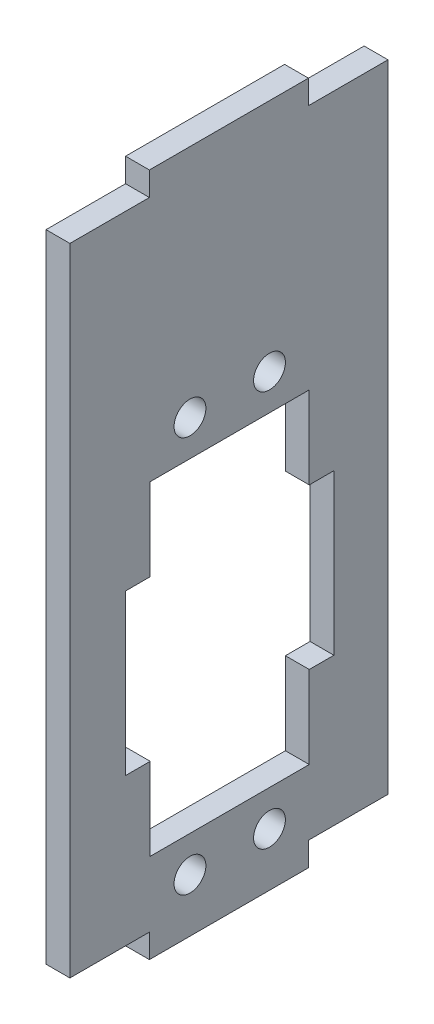
ISO-10303-21;
HEADER;
FILE_DESCRIPTION(('STEP AP214'),'2;1');
FILE_NAME('part.step','',(''),(''),'','','');
FILE_SCHEMA(('AUTOMOTIVE_DESIGN { 1 0 10303 214 1 1 1 1 }'));
ENDSEC;
DATA;
#1=APPLICATION_CONTEXT('core data for automotive mechanical design processes');
#2=APPLICATION_PROTOCOL_DEFINITION('international standard','automotive_design',2000,#1);
#3=PRODUCT_CONTEXT('',#1,'mechanical');
#4=PRODUCT('Part','Part','',(#3));
#5=PRODUCT_RELATED_PRODUCT_CATEGORY('part','',(#4));
#6=PRODUCT_DEFINITION_FORMATION('','',#4);
#7=PRODUCT_DEFINITION_CONTEXT('part definition',#1,'design');
#8=PRODUCT_DEFINITION('design','',#6,#7);
#9=PRODUCT_DEFINITION_SHAPE('','',#8);
#10=(LENGTH_UNIT() NAMED_UNIT(*) SI_UNIT(.MILLI.,.METRE.));
#11=(NAMED_UNIT(*) PLANE_ANGLE_UNIT() SI_UNIT($,.RADIAN.));
#12=(NAMED_UNIT(*) SI_UNIT($,.STERADIAN.) SOLID_ANGLE_UNIT());
#13=UNCERTAINTY_MEASURE_WITH_UNIT(LENGTH_MEASURE(1.E-05),#10,'distance_accuracy_value','');
#14=(GEOMETRIC_REPRESENTATION_CONTEXT(3) GLOBAL_UNCERTAINTY_ASSIGNED_CONTEXT((#13)) GLOBAL_UNIT_ASSIGNED_CONTEXT((#10,
#11,#12)) REPRESENTATION_CONTEXT('',''));
#15=CARTESIAN_POINT('',(0.,0.,0.));
#16=DIRECTION('',(0.,0.,1.));
#17=DIRECTION('',(1.,0.,0.));
#18=AXIS2_PLACEMENT_3D('',#15,#16,#17);
#19=CARTESIAN_POINT('',(0.,89.2755790734939,11.5037745496095));
#20=DIRECTION('',(0.,1.,0.));
#21=DIRECTION('',(0.,0.,1.));
#22=AXIS2_PLACEMENT_3D('',#19,#20,#21);
#23=PLANE('',#22);
#24=DIRECTION('',(0.,0.,1.));
#25=VECTOR('',#24,1.);
#26=CARTESIAN_POINT('',(3.,89.2755790734939,11.5037745496095));
#27=LINE('',#26,#25);
#28=CARTESIAN_POINT('',(3.,89.2755790734939,11.5037745496095));
#29=VERTEX_POINT('',#28);
#30=CARTESIAN_POINT('',(3.,89.2755790734939,31.5037745496095));
#31=VERTEX_POINT('',#30);
#32=EDGE_CURVE('E308',#29,#31,#27,.T.);
#33=ORIENTED_EDGE('',*,*,#32,.F.);
#34=DIRECTION('',(1.,0.,0.));
#35=VECTOR('',#34,1.);
#36=CARTESIAN_POINT('',(0.,89.2755790734939,11.5037745496095));
#37=LINE('',#36,#35);
#38=CARTESIAN_POINT('',(0.,89.2755790734939,11.5037745496095));
#39=VERTEX_POINT('',#38);
#40=EDGE_CURVE('E11',#39,#29,#37,.T.);
#41=ORIENTED_EDGE('',*,*,#40,.F.);
#42=DIRECTION('',(0.,0.,1.));
#43=VECTOR('',#42,1.);
#44=CARTESIAN_POINT('',(0.,89.2755790734939,11.5037745496095));
#45=LINE('',#44,#43);
#46=CARTESIAN_POINT('',(0.,89.2755790734939,31.5037745496095));
#47=VERTEX_POINT('',#46);
#48=EDGE_CURVE('E311',#39,#47,#45,.T.);
#49=ORIENTED_EDGE('',*,*,#48,.T.);
#50=DIRECTION('',(1.,0.,0.));
#51=VECTOR('',#50,1.);
#52=CARTESIAN_POINT('',(0.,89.2755790734939,31.5037745496095));
#53=LINE('',#52,#51);
#54=EDGE_CURVE('E36',#47,#31,#53,.T.);
#55=ORIENTED_EDGE('',*,*,#54,.T.);
#56=EDGE_LOOP('',(#33,#41,#49,#55));
#57=FACE_BOUND('',#56,.T.);
#58=ADVANCED_FACE('F33',(#57),#23,.T.);
#59=CARTESIAN_POINT('',(0.,86.275579073494,11.5037745496095));
#60=DIRECTION('',(0.,0.,-1.));
#61=DIRECTION('',(-1.,0.,0.));
#62=AXIS2_PLACEMENT_3D('',#59,#60,#61);
#63=PLANE('',#62);
#64=DIRECTION('',(0.,1.,0.));
#65=VECTOR('',#64,1.);
#66=CARTESIAN_POINT('',(3.,86.275579073494,11.5037745496095));
#67=LINE('',#66,#65);
#68=CARTESIAN_POINT('',(3.,86.275579073494,11.5037745496095));
#69=VERTEX_POINT('',#68);
#70=EDGE_CURVE('E315',#69,#29,#67,.T.);
#71=ORIENTED_EDGE('',*,*,#70,.F.);
#72=DIRECTION('',(1.,0.,0.));
#73=VECTOR('',#72,1.);
#74=CARTESIAN_POINT('',(0.,86.275579073494,11.5037745496095));
#75=LINE('',#74,#73);
#76=CARTESIAN_POINT('',(0.,86.275579073494,11.5037745496095));
#77=VERTEX_POINT('',#76);
#78=EDGE_CURVE('E41',#77,#69,#75,.T.);
#79=ORIENTED_EDGE('',*,*,#78,.F.);
#80=DIRECTION('',(0.,1.,0.));
#81=VECTOR('',#80,1.);
#82=CARTESIAN_POINT('',(0.,86.275579073494,11.5037745496095));
#83=LINE('',#82,#81);
#84=EDGE_CURVE('E345',#77,#39,#83,.T.);
#85=ORIENTED_EDGE('',*,*,#84,.T.);
#86=ORIENTED_EDGE('',*,*,#40,.T.);
#87=EDGE_LOOP('',(#71,#79,#85,#86));
#88=FACE_BOUND('',#87,.T.);
#89=ADVANCED_FACE('F411',(#88),#63,.T.);
#90=CARTESIAN_POINT('',(0.,86.2755790734939,1.50377454960949));
#91=DIRECTION('',(0.,1.,0.));
#92=DIRECTION('',(0.,0.,1.));
#93=AXIS2_PLACEMENT_3D('',#90,#91,#92);
#94=PLANE('',#93);
#95=DIRECTION('',(0.,0.,1.));
#96=VECTOR('',#95,1.);
#97=CARTESIAN_POINT('',(3.,86.2755790734939,1.50377454960949));
#98=LINE('',#97,#96);
#99=CARTESIAN_POINT('',(3.,86.2755790734939,1.50377454960949));
#100=VERTEX_POINT('',#99);
#101=EDGE_CURVE('E377',#100,#69,#98,.T.);
#102=ORIENTED_EDGE('',*,*,#101,.F.);
#103=DIRECTION('',(1.,0.,0.));
#104=VECTOR('',#103,1.);
#105=CARTESIAN_POINT('',(0.,86.2755790734939,1.50377454960949));
#106=LINE('',#105,#104);
#107=CARTESIAN_POINT('',(0.,86.2755790734939,1.50377454960949));
#108=VERTEX_POINT('',#107);
#109=EDGE_CURVE('E383',#108,#100,#106,.T.);
#110=ORIENTED_EDGE('',*,*,#109,.F.);
#111=DIRECTION('',(0.,0.,1.));
#112=VECTOR('',#111,1.);
#113=CARTESIAN_POINT('',(0.,86.2755790734939,1.50377454960949));
#114=LINE('',#113,#112);
#115=EDGE_CURVE('E342',#108,#77,#114,.T.);
#116=ORIENTED_EDGE('',*,*,#115,.T.);
#117=ORIENTED_EDGE('',*,*,#78,.T.);
#118=EDGE_LOOP('',(#102,#110,#116,#117));
#119=FACE_BOUND('',#118,.T.);
#120=ADVANCED_FACE('F448',(#119),#94,.T.);
#121=CARTESIAN_POINT('',(0.,6.27557907349394,1.50377454960949));
#122=DIRECTION('',(0.,0.,-1.));
#123=DIRECTION('',(-1.,0.,0.));
#124=AXIS2_PLACEMENT_3D('',#121,#122,#123);
#125=PLANE('',#124);
#126=DIRECTION('',(0.,1.,0.));
#127=VECTOR('',#126,1.);
#128=CARTESIAN_POINT('',(3.,6.27557907349394,1.50377454960949));
#129=LINE('',#128,#127);
#130=CARTESIAN_POINT('',(3.,6.27557907349394,1.50377454960949));
#131=VERTEX_POINT('',#130);
#132=EDGE_CURVE('E374',#131,#100,#129,.T.);
#133=ORIENTED_EDGE('',*,*,#132,.F.);
#134=DIRECTION('',(1.,0.,0.));
#135=VECTOR('',#134,1.);
#136=CARTESIAN_POINT('',(0.,6.27557907349394,1.50377454960949));
#137=LINE('',#136,#135);
#138=CARTESIAN_POINT('',(0.,6.27557907349394,1.50377454960949));
#139=VERTEX_POINT('',#138);
#140=EDGE_CURVE('E385',#139,#131,#137,.T.);
#141=ORIENTED_EDGE('',*,*,#140,.F.);
#142=DIRECTION('',(0.,1.,0.));
#143=VECTOR('',#142,1.);
#144=CARTESIAN_POINT('',(0.,6.27557907349394,1.50377454960949));
#145=LINE('',#144,#143);
#146=EDGE_CURVE('E339',#139,#108,#145,.T.);
#147=ORIENTED_EDGE('',*,*,#146,.T.);
#148=ORIENTED_EDGE('',*,*,#109,.T.);
#149=EDGE_LOOP('',(#133,#141,#147,#148));
#150=FACE_BOUND('',#149,.T.);
#151=ADVANCED_FACE('F445',(#150),#125,.T.);
#152=CARTESIAN_POINT('',(0.,6.27557907349394,11.5037745496095));
#153=DIRECTION('',(0.,-1.,0.));
#154=DIRECTION('',(0.,0.,-1.));
#155=AXIS2_PLACEMENT_3D('',#152,#153,#154);
#156=PLANE('',#155);
#157=DIRECTION('',(0.,0.,-1.));
#158=VECTOR('',#157,1.);
#159=CARTESIAN_POINT('',(3.,6.27557907349394,11.5037745496095));
#160=LINE('',#159,#158);
#161=CARTESIAN_POINT('',(3.,6.27557907349394,11.5037745496095));
#162=VERTEX_POINT('',#161);
#163=EDGE_CURVE('E371',#162,#131,#160,.T.);
#164=ORIENTED_EDGE('',*,*,#163,.F.);
#165=DIRECTION('',(1.,0.,0.));
#166=VECTOR('',#165,1.);
#167=CARTESIAN_POINT('',(0.,6.27557907349394,11.5037745496095));
#168=LINE('',#167,#166);
#169=CARTESIAN_POINT('',(0.,6.27557907349394,11.5037745496095));
#170=VERTEX_POINT('',#169);
#171=EDGE_CURVE('E387',#170,#162,#168,.T.);
#172=ORIENTED_EDGE('',*,*,#171,.F.);
#173=DIRECTION('',(0.,0.,-1.));
#174=VECTOR('',#173,1.);
#175=CARTESIAN_POINT('',(0.,6.27557907349394,11.5037745496095));
#176=LINE('',#175,#174);
#177=EDGE_CURVE('E336',#170,#139,#176,.T.);
#178=ORIENTED_EDGE('',*,*,#177,.T.);
#179=ORIENTED_EDGE('',*,*,#140,.T.);
#180=EDGE_LOOP('',(#164,#172,#178,#179));
#181=FACE_BOUND('',#180,.T.);
#182=ADVANCED_FACE('F442',(#181),#156,.T.);
#183=CARTESIAN_POINT('',(0.,3.27557907349393,11.5037745496095));
#184=DIRECTION('',(0.,0.,-1.));
#185=DIRECTION('',(-1.,0.,0.));
#186=AXIS2_PLACEMENT_3D('',#183,#184,#185);
#187=PLANE('',#186);
#188=DIRECTION('',(0.,1.,0.));
#189=VECTOR('',#188,1.);
#190=CARTESIAN_POINT('',(3.,3.27557907349393,11.5037745496095));
#191=LINE('',#190,#189);
#192=CARTESIAN_POINT('',(3.,3.27557907349393,11.5037745496095));
#193=VERTEX_POINT('',#192);
#194=EDGE_CURVE('E368',#193,#162,#191,.T.);
#195=ORIENTED_EDGE('',*,*,#194,.F.);
#196=DIRECTION('',(1.,0.,0.));
#197=VECTOR('',#196,1.);
#198=CARTESIAN_POINT('',(0.,3.27557907349393,11.5037745496095));
#199=LINE('',#198,#197);
#200=CARTESIAN_POINT('',(0.,3.27557907349393,11.5037745496095));
#201=VERTEX_POINT('',#200);
#202=EDGE_CURVE('E389',#201,#193,#199,.T.);
#203=ORIENTED_EDGE('',*,*,#202,.F.);
#204=DIRECTION('',(0.,1.,0.));
#205=VECTOR('',#204,1.);
#206=CARTESIAN_POINT('',(0.,3.27557907349393,11.5037745496095));
#207=LINE('',#206,#205);
#208=EDGE_CURVE('E333',#201,#170,#207,.T.);
#209=ORIENTED_EDGE('',*,*,#208,.T.);
#210=ORIENTED_EDGE('',*,*,#171,.T.);
#211=EDGE_LOOP('',(#195,#203,#209,#210));
#212=FACE_BOUND('',#211,.T.);
#213=ADVANCED_FACE('F438',(#212),#187,.T.);
#214=CARTESIAN_POINT('',(0.,3.27557907349393,31.5037745496095));
#215=DIRECTION('',(0.,-1.,0.));
#216=DIRECTION('',(0.,0.,-1.));
#217=AXIS2_PLACEMENT_3D('',#214,#215,#216);
#218=PLANE('',#217);
#219=DIRECTION('',(0.,0.,-1.));
#220=VECTOR('',#219,1.);
#221=CARTESIAN_POINT('',(3.,3.27557907349393,31.5037745496095));
#222=LINE('',#221,#220);
#223=CARTESIAN_POINT('',(3.,3.27557907349393,31.5037745496095));
#224=VERTEX_POINT('',#223);
#225=EDGE_CURVE('E365',#224,#193,#222,.T.);
#226=ORIENTED_EDGE('',*,*,#225,.F.);
#227=DIRECTION('',(1.,0.,0.));
#228=VECTOR('',#227,1.);
#229=CARTESIAN_POINT('',(0.,3.27557907349393,31.5037745496095));
#230=LINE('',#229,#228);
#231=CARTESIAN_POINT('',(0.,3.27557907349393,31.5037745496095));
#232=VERTEX_POINT('',#231);
#233=EDGE_CURVE('E391',#232,#224,#230,.T.);
#234=ORIENTED_EDGE('',*,*,#233,.F.);
#235=DIRECTION('',(0.,0.,-1.));
#236=VECTOR('',#235,1.);
#237=CARTESIAN_POINT('',(0.,3.27557907349393,31.5037745496095));
#238=LINE('',#237,#236);
#239=EDGE_CURVE('E330',#232,#201,#238,.T.);
#240=ORIENTED_EDGE('',*,*,#239,.T.);
#241=ORIENTED_EDGE('',*,*,#202,.T.);
#242=EDGE_LOOP('',(#226,#234,#240,#241));
#243=FACE_BOUND('',#242,.T.);
#244=ADVANCED_FACE('F434',(#243),#218,.T.);
#245=CARTESIAN_POINT('',(0.,6.27557907349394,31.5037745496095));
#246=DIRECTION('',(0.,0.,1.));
#247=DIRECTION('',(1.,0.,0.));
#248=AXIS2_PLACEMENT_3D('',#245,#246,#247);
#249=PLANE('',#248);
#250=DIRECTION('',(0.,-1.,0.));
#251=VECTOR('',#250,1.);
#252=CARTESIAN_POINT('',(3.,6.27557907349394,31.5037745496095));
#253=LINE('',#252,#251);
#254=CARTESIAN_POINT('',(3.,6.27557907349394,31.5037745496095));
#255=VERTEX_POINT('',#254);
#256=EDGE_CURVE('E362',#255,#224,#253,.T.);
#257=ORIENTED_EDGE('',*,*,#256,.F.);
#258=DIRECTION('',(1.,0.,0.));
#259=VECTOR('',#258,1.);
#260=CARTESIAN_POINT('',(0.,6.27557907349394,31.5037745496095));
#261=LINE('',#260,#259);
#262=CARTESIAN_POINT('',(0.,6.27557907349394,31.5037745496095));
#263=VERTEX_POINT('',#262);
#264=EDGE_CURVE('E393',#263,#255,#261,.T.);
#265=ORIENTED_EDGE('',*,*,#264,.F.);
#266=DIRECTION('',(0.,-1.,0.));
#267=VECTOR('',#266,1.);
#268=CARTESIAN_POINT('',(0.,6.27557907349394,31.5037745496095));
#269=LINE('',#268,#267);
#270=EDGE_CURVE('E327',#263,#232,#269,.T.);
#271=ORIENTED_EDGE('',*,*,#270,.T.);
#272=ORIENTED_EDGE('',*,*,#233,.T.);
#273=EDGE_LOOP('',(#257,#265,#271,#272));
#274=FACE_BOUND('',#273,.T.);
#275=ADVANCED_FACE('F430',(#274),#249,.T.);
#276=CARTESIAN_POINT('',(0.,6.27557907349394,41.5037745496095));
#277=DIRECTION('',(0.,-1.,0.));
#278=DIRECTION('',(0.,0.,-1.));
#279=AXIS2_PLACEMENT_3D('',#276,#277,#278);
#280=PLANE('',#279);
#281=DIRECTION('',(0.,0.,-1.));
#282=VECTOR('',#281,1.);
#283=CARTESIAN_POINT('',(3.,6.27557907349394,41.5037745496095));
#284=LINE('',#283,#282);
#285=CARTESIAN_POINT('',(3.,6.27557907349394,41.5037745496095));
#286=VERTEX_POINT('',#285);
#287=EDGE_CURVE('E359',#286,#255,#284,.T.);
#288=ORIENTED_EDGE('',*,*,#287,.F.);
#289=DIRECTION('',(1.,0.,0.));
#290=VECTOR('',#289,1.);
#291=CARTESIAN_POINT('',(0.,6.27557907349394,41.5037745496095));
#292=LINE('',#291,#290);
#293=CARTESIAN_POINT('',(0.,6.27557907349394,41.5037745496095));
#294=VERTEX_POINT('',#293);
#295=EDGE_CURVE('E395',#294,#286,#292,.T.);
#296=ORIENTED_EDGE('',*,*,#295,.F.);
#297=DIRECTION('',(0.,0.,-1.));
#298=VECTOR('',#297,1.);
#299=CARTESIAN_POINT('',(0.,6.27557907349394,41.5037745496095));
#300=LINE('',#299,#298);
#301=EDGE_CURVE('E324',#294,#263,#300,.T.);
#302=ORIENTED_EDGE('',*,*,#301,.T.);
#303=ORIENTED_EDGE('',*,*,#264,.T.);
#304=EDGE_LOOP('',(#288,#296,#302,#303));
#305=FACE_BOUND('',#304,.T.);
#306=ADVANCED_FACE('F426',(#305),#280,.T.);
#307=CARTESIAN_POINT('',(0.,86.2755790734939,41.5037745496095));
#308=DIRECTION('',(0.,0.,1.));
#309=DIRECTION('',(0.,-1.,0.));
#310=AXIS2_PLACEMENT_3D('',#307,#308,#309);
#311=PLANE('',#310);
#312=DIRECTION('',(0.,-1.,0.));
#313=VECTOR('',#312,1.);
#314=CARTESIAN_POINT('',(3.,86.2755790734939,41.5037745496095));
#315=LINE('',#314,#313);
#316=CARTESIAN_POINT('',(3.,86.2755790734939,41.5037745496095));
#317=VERTEX_POINT('',#316);
#318=EDGE_CURVE('E356',#317,#286,#315,.T.);
#319=ORIENTED_EDGE('',*,*,#318,.F.);
#320=DIRECTION('',(1.,0.,0.));
#321=VECTOR('',#320,1.);
#322=CARTESIAN_POINT('',(0.,86.2755790734939,41.5037745496095));
#323=LINE('',#322,#321);
#324=CARTESIAN_POINT('',(0.,86.2755790734939,41.5037745496095));
#325=VERTEX_POINT('',#324);
#326=EDGE_CURVE('E397',#325,#317,#323,.T.);
#327=ORIENTED_EDGE('',*,*,#326,.F.);
#328=DIRECTION('',(0.,-1.,0.));
#329=VECTOR('',#328,1.);
#330=CARTESIAN_POINT('',(0.,86.2755790734939,41.5037745496095));
#331=LINE('',#330,#329);
#332=EDGE_CURVE('E321',#325,#294,#331,.T.);
#333=ORIENTED_EDGE('',*,*,#332,.T.);
#334=ORIENTED_EDGE('',*,*,#295,.T.);
#335=EDGE_LOOP('',(#319,#327,#333,#334));
#336=FACE_BOUND('',#335,.T.);
#337=ADVANCED_FACE('F424',(#336),#311,.T.);
#338=CARTESIAN_POINT('',(0.,86.275579073494,31.5037745496095));
#339=DIRECTION('',(0.,1.,0.));
#340=DIRECTION('',(0.,0.,1.));
#341=AXIS2_PLACEMENT_3D('',#338,#339,#340);
#342=PLANE('',#341);
#343=DIRECTION('',(0.,0.,1.));
#344=VECTOR('',#343,1.);
#345=CARTESIAN_POINT('',(3.,86.275579073494,31.5037745496095));
#346=LINE('',#345,#344);
#347=CARTESIAN_POINT('',(3.,86.275579073494,31.5037745496095));
#348=VERTEX_POINT('',#347);
#349=EDGE_CURVE('E353',#348,#317,#346,.T.);
#350=ORIENTED_EDGE('',*,*,#349,.F.);
#351=DIRECTION('',(1.,0.,0.));
#352=VECTOR('',#351,1.);
#353=CARTESIAN_POINT('',(0.,86.275579073494,31.5037745496095));
#354=LINE('',#353,#352);
#355=CARTESIAN_POINT('',(0.,86.275579073494,31.5037745496095));
#356=VERTEX_POINT('',#355);
#357=EDGE_CURVE('E398',#356,#348,#354,.T.);
#358=ORIENTED_EDGE('',*,*,#357,.F.);
#359=DIRECTION('',(0.,0.,1.));
#360=VECTOR('',#359,1.);
#361=CARTESIAN_POINT('',(0.,86.275579073494,31.5037745496095));
#362=LINE('',#361,#360);
#363=EDGE_CURVE('E318',#356,#325,#362,.T.);
#364=ORIENTED_EDGE('',*,*,#363,.T.);
#365=ORIENTED_EDGE('',*,*,#326,.T.);
#366=EDGE_LOOP('',(#350,#358,#364,#365));
#367=FACE_BOUND('',#366,.T.);
#368=ADVANCED_FACE('F420',(#367),#342,.T.);
#369=CARTESIAN_POINT('',(0.,89.2755790734939,31.5037745496095));
#370=DIRECTION('',(0.,0.,1.));
#371=DIRECTION('',(1.,0.,0.));
#372=AXIS2_PLACEMENT_3D('',#369,#370,#371);
#373=PLANE('',#372);
#374=DIRECTION('',(0.,-1.,0.));
#375=VECTOR('',#374,1.);
#376=CARTESIAN_POINT('',(3.,89.2755790734939,31.5037745496095));
#377=LINE('',#376,#375);
#378=EDGE_CURVE('E350',#31,#348,#377,.T.);
#379=ORIENTED_EDGE('',*,*,#378,.F.);
#380=ORIENTED_EDGE('',*,*,#54,.F.);
#381=DIRECTION('',(0.,-1.,0.));
#382=VECTOR('',#381,1.);
#383=CARTESIAN_POINT('',(0.,89.2755790734939,31.5037745496095));
#384=LINE('',#383,#382);
#385=EDGE_CURVE('E314',#47,#356,#384,.T.);
#386=ORIENTED_EDGE('',*,*,#385,.T.);
#387=ORIENTED_EDGE('',*,*,#357,.T.);
#388=EDGE_LOOP('',(#379,#380,#386,#387));
#389=FACE_BOUND('',#388,.T.);
#390=ADVANCED_FACE('F406',(#389),#373,.T.);
#391=CARTESIAN_POINT('',(0.,0.,0.));
#392=DIRECTION('',(1.,0.,0.));
#393=DIRECTION('',(0.,0.,-1.));
#394=AXIS2_PLACEMENT_3D('',#391,#392,#393);
#395=PLANE('',#394);
#396=CARTESIAN_POINT('',(0.,9.97557907349397,16.4037745496095));
#397=DIRECTION('',(-1.,0.,0.));
#398=DIRECTION('',(0.,0.,-1.));
#399=AXIS2_PLACEMENT_3D('',#396,#397,#398);
#400=CIRCLE('',#399,2.00000000000001);
#401=CARTESIAN_POINT('',(0.,9.97557907349397,14.4037745496095));
#402=VERTEX_POINT('',#401);
#403=EDGE_CURVE('E720',#402,#402,#400,.T.);
#404=ORIENTED_EDGE('',*,*,#403,.F.);
#405=EDGE_LOOP('',(#404));
#406=FACE_BOUND('',#405,.T.);
#407=CARTESIAN_POINT('',(0.,59.775579073494,26.4037745496095));
#408=DIRECTION('',(-1.,0.,0.));
#409=DIRECTION('',(0.,0.,-1.));
#410=AXIS2_PLACEMENT_3D('',#407,#408,#409);
#411=CIRCLE('',#410,2.00000000000001);
#412=CARTESIAN_POINT('',(0.,59.775579073494,24.4037745496095));
#413=VERTEX_POINT('',#412);
#414=EDGE_CURVE('E219',#413,#413,#411,.T.);
#415=ORIENTED_EDGE('',*,*,#414,.F.);
#416=EDGE_LOOP('',(#415));
#417=FACE_BOUND('',#416,.T.);
#418=DIRECTION('',(0.,-1.,0.));
#419=VECTOR('',#418,1.);
#420=CARTESIAN_POINT('',(0.,24.8255790734939,8.30377454960953));
#421=LINE('',#420,#419);
#422=CARTESIAN_POINT('',(0.,44.9255790734939,8.30377454960953));
#423=VERTEX_POINT('',#422);
#424=CARTESIAN_POINT('',(0.,24.8255790734939,8.30377454960953));
#425=VERTEX_POINT('',#424);
#426=EDGE_CURVE('E248',#423,#425,#421,.T.);
#427=ORIENTED_EDGE('',*,*,#426,.F.);
#428=DIRECTION('',(0.,0.,-1.));
#429=VECTOR('',#428,1.);
#430=CARTESIAN_POINT('',(0.,44.9255790734939,8.30377454960953));
#431=LINE('',#430,#429);
#432=CARTESIAN_POINT('',(0.,44.9255790734939,11.4037745496095));
#433=VERTEX_POINT('',#432);
#434=EDGE_CURVE('E49',#433,#423,#431,.T.);
#435=ORIENTED_EDGE('',*,*,#434,.F.);
#436=DIRECTION('',(0.,-1.,0.));
#437=VECTOR('',#436,1.);
#438=CARTESIAN_POINT('',(0.,44.9255790734939,11.4037745496095));
#439=LINE('',#438,#437);
#440=CARTESIAN_POINT('',(0.,55.2755790734939,11.4037745496095));
#441=VERTEX_POINT('',#440);
#442=EDGE_CURVE('E213',#441,#433,#439,.T.);
#443=ORIENTED_EDGE('',*,*,#442,.F.);
#444=DIRECTION('',(0.,0.,-1.));
#445=VECTOR('',#444,1.);
#446=CARTESIAN_POINT('',(0.,55.2755790734939,11.4037745496095));
#447=LINE('',#446,#445);
#448=CARTESIAN_POINT('',(0.,55.2755790734939,31.4037745496095));
#449=VERTEX_POINT('',#448);
#450=EDGE_CURVE('E216',#449,#441,#447,.T.);
#451=ORIENTED_EDGE('',*,*,#450,.F.);
#452=DIRECTION('',(0.,1.,0.));
#453=VECTOR('',#452,1.);
#454=CARTESIAN_POINT('',(0.,55.2755790734939,31.4037745496095));
#455=LINE('',#454,#453);
#456=CARTESIAN_POINT('',(0.,44.9255790734939,31.4037745496095));
#457=VERTEX_POINT('',#456);
#458=EDGE_CURVE('E272',#457,#449,#455,.T.);
#459=ORIENTED_EDGE('',*,*,#458,.F.);
#460=DIRECTION('',(0.,0.,-1.));
#461=VECTOR('',#460,1.);
#462=CARTESIAN_POINT('',(0.,44.9255790734939,31.4037745496095));
#463=LINE('',#462,#461);
#464=CARTESIAN_POINT('',(0.,44.9255790734939,34.5037745496095));
#465=VERTEX_POINT('',#464);
#466=EDGE_CURVE('E269',#465,#457,#463,.T.);
#467=ORIENTED_EDGE('',*,*,#466,.F.);
#468=DIRECTION('',(0.,1.,0.));
#469=VECTOR('',#468,1.);
#470=CARTESIAN_POINT('',(0.,44.9255790734939,34.5037745496095));
#471=LINE('',#470,#469);
#472=CARTESIAN_POINT('',(0.,24.8255790734939,34.5037745496095));
#473=VERTEX_POINT('',#472);
#474=EDGE_CURVE('E266',#473,#465,#471,.T.);
#475=ORIENTED_EDGE('',*,*,#474,.F.);
#476=DIRECTION('',(0.,0.,1.));
#477=VECTOR('',#476,1.);
#478=CARTESIAN_POINT('',(0.,24.8255790734939,34.5037745496095));
#479=LINE('',#478,#477);
#480=CARTESIAN_POINT('',(0.,24.8255790734939,31.4037745496095));
#481=VERTEX_POINT('',#480);
#482=EDGE_CURVE('E263',#481,#473,#479,.T.);
#483=ORIENTED_EDGE('',*,*,#482,.F.);
#484=DIRECTION('',(0.,1.,0.));
#485=VECTOR('',#484,1.);
#486=CARTESIAN_POINT('',(0.,24.8255790734939,31.4037745496095));
#487=LINE('',#486,#485);
#488=CARTESIAN_POINT('',(0.,14.4755790734939,31.4037745496095));
#489=VERTEX_POINT('',#488);
#490=EDGE_CURVE('E260',#489,#481,#487,.T.);
#491=ORIENTED_EDGE('',*,*,#490,.F.);
#492=DIRECTION('',(0.,0.,1.));
#493=VECTOR('',#492,1.);
#494=CARTESIAN_POINT('',(0.,14.4755790734939,31.4037745496095));
#495=LINE('',#494,#493);
#496=CARTESIAN_POINT('',(0.,14.4755790734939,11.4037745496095));
#497=VERTEX_POINT('',#496);
#498=EDGE_CURVE('E257',#497,#489,#495,.T.);
#499=ORIENTED_EDGE('',*,*,#498,.F.);
#500=DIRECTION('',(0.,-1.,0.));
#501=VECTOR('',#500,1.);
#502=CARTESIAN_POINT('',(0.,14.4755790734939,11.4037745496095));
#503=LINE('',#502,#501);
#504=CARTESIAN_POINT('',(0.,24.8255790734939,11.4037745496095));
#505=VERTEX_POINT('',#504);
#506=EDGE_CURVE('E254',#505,#497,#503,.T.);
#507=ORIENTED_EDGE('',*,*,#506,.F.);
#508=DIRECTION('',(0.,0.,1.));
#509=VECTOR('',#508,1.);
#510=CARTESIAN_POINT('',(0.,24.8255790734939,11.4037745496095));
#511=LINE('',#510,#509);
#512=EDGE_CURVE('E251',#425,#505,#511,.T.);
#513=ORIENTED_EDGE('',*,*,#512,.F.);
#514=EDGE_LOOP('',(#427,#435,#443,#451,#459,#467,#475,#483,#491,#499,#507,#513));
#515=FACE_BOUND('',#514,.T.);
#516=CARTESIAN_POINT('',(0.,59.775579073494,16.4037745496095));
#517=DIRECTION('',(-1.,0.,0.));
#518=DIRECTION('',(0.,0.,-1.));
#519=AXIS2_PLACEMENT_3D('',#516,#517,#518);
#520=CIRCLE('',#519,2.00000000000001);
#521=CARTESIAN_POINT('',(0.,59.775579073494,14.4037745496095));
#522=VERTEX_POINT('',#521);
#523=EDGE_CURVE('E279',#522,#522,#520,.T.);
#524=ORIENTED_EDGE('',*,*,#523,.F.);
#525=EDGE_LOOP('',(#524));
#526=FACE_BOUND('',#525,.T.);
#527=CARTESIAN_POINT('',(0.,9.97557907349395,26.4037745496095));
#528=DIRECTION('',(-1.,0.,0.));
#529=DIRECTION('',(0.,0.,-1.));
#530=AXIS2_PLACEMENT_3D('',#527,#528,#529);
#531=CIRCLE('',#530,2.);
#532=CARTESIAN_POINT('',(0.,9.97557907349395,24.4037745496095));
#533=VERTEX_POINT('',#532);
#534=EDGE_CURVE('E302',#533,#533,#531,.T.);
#535=ORIENTED_EDGE('',*,*,#534,.F.);
#536=EDGE_LOOP('',(#535));
#537=FACE_BOUND('',#536,.T.);
#538=ORIENTED_EDGE('',*,*,#48,.F.);
#539=ORIENTED_EDGE('',*,*,#84,.F.);
#540=ORIENTED_EDGE('',*,*,#115,.F.);
#541=ORIENTED_EDGE('',*,*,#146,.F.);
#542=ORIENTED_EDGE('',*,*,#177,.F.);
#543=ORIENTED_EDGE('',*,*,#208,.F.);
#544=ORIENTED_EDGE('',*,*,#239,.F.);
#545=ORIENTED_EDGE('',*,*,#270,.F.);
#546=ORIENTED_EDGE('',*,*,#301,.F.);
#547=ORIENTED_EDGE('',*,*,#332,.F.);
#548=ORIENTED_EDGE('',*,*,#363,.F.);
#549=ORIENTED_EDGE('',*,*,#385,.F.);
#550=EDGE_LOOP('',(#538,#539,#540,#541,#542,#543,#544,#545,#546,#547,#548,#549));
#551=FACE_BOUND('',#550,.T.);
#552=ADVANCED_FACE('F414',(#406,#417,#515,#526,#537,#551),#395,.F.);
#553=CARTESIAN_POINT('',(3.,0.,0.));
#554=DIRECTION('',(1.,0.,0.));
#555=DIRECTION('',(0.,0.,-1.));
#556=AXIS2_PLACEMENT_3D('',#553,#554,#555);
#557=PLANE('',#556);
#558=CARTESIAN_POINT('',(3.,9.97557907349397,16.4037745496095));
#559=DIRECTION('',(-1.,0.,0.));
#560=DIRECTION('',(0.,0.,-1.));
#561=AXIS2_PLACEMENT_3D('',#558,#559,#560);
#562=CIRCLE('',#561,2.00000000000001);
#563=CARTESIAN_POINT('',(3.,9.97557907349397,14.4037745496095));
#564=VERTEX_POINT('',#563);
#565=EDGE_CURVE('E717',#564,#564,#562,.T.);
#566=ORIENTED_EDGE('',*,*,#565,.T.);
#567=EDGE_LOOP('',(#566));
#568=FACE_BOUND('',#567,.T.);
#569=CARTESIAN_POINT('',(3.,59.775579073494,26.4037745496095));
#570=DIRECTION('',(-1.,0.,0.));
#571=DIRECTION('',(0.,0.,-1.));
#572=AXIS2_PLACEMENT_3D('',#569,#570,#571);
#573=CIRCLE('',#572,2.00000000000001);
#574=CARTESIAN_POINT('',(3.,59.775579073494,24.4037745496095));
#575=VERTEX_POINT('',#574);
#576=EDGE_CURVE('E249',#575,#575,#573,.T.);
#577=ORIENTED_EDGE('',*,*,#576,.T.);
#578=EDGE_LOOP('',(#577));
#579=FACE_BOUND('',#578,.T.);
#580=DIRECTION('',(0.,0.,-1.));
#581=VECTOR('',#580,1.);
#582=CARTESIAN_POINT('',(3.,44.9255790734939,8.30377454960953));
#583=LINE('',#582,#581);
#584=CARTESIAN_POINT('',(3.,44.9255790734939,11.4037745496095));
#585=VERTEX_POINT('',#584);
#586=CARTESIAN_POINT('',(3.,44.9255790734939,8.30377454960953));
#587=VERTEX_POINT('',#586);
#588=EDGE_CURVE('E196',#585,#587,#583,.T.);
#589=ORIENTED_EDGE('',*,*,#588,.T.);
#590=DIRECTION('',(0.,-1.,0.));
#591=VECTOR('',#590,1.);
#592=CARTESIAN_POINT('',(3.,24.8255790734939,8.30377454960953));
#593=LINE('',#592,#591);
#594=CARTESIAN_POINT('',(3.,24.8255790734939,8.30377454960953));
#595=VERTEX_POINT('',#594);
#596=EDGE_CURVE('E205',#587,#595,#593,.T.);
#597=ORIENTED_EDGE('',*,*,#596,.T.);
#598=DIRECTION('',(0.,0.,1.));
#599=VECTOR('',#598,1.);
#600=CARTESIAN_POINT('',(3.,24.8255790734939,11.4037745496095));
#601=LINE('',#600,#599);
#602=CARTESIAN_POINT('',(3.,24.8255790734939,11.4037745496095));
#603=VERTEX_POINT('',#602);
#604=EDGE_CURVE('E57',#595,#603,#601,.T.);
#605=ORIENTED_EDGE('',*,*,#604,.T.);
#606=DIRECTION('',(0.,-1.,0.));
#607=VECTOR('',#606,1.);
#608=CARTESIAN_POINT('',(3.,14.4755790734939,11.4037745496095));
#609=LINE('',#608,#607);
#610=CARTESIAN_POINT('',(3.,14.4755790734939,11.4037745496095));
#611=VERTEX_POINT('',#610);
#612=EDGE_CURVE('E223',#603,#611,#609,.T.);
#613=ORIENTED_EDGE('',*,*,#612,.T.);
#614=DIRECTION('',(0.,0.,1.));
#615=VECTOR('',#614,1.);
#616=CARTESIAN_POINT('',(3.,14.4755790734939,31.4037745496095));
#617=LINE('',#616,#615);
#618=CARTESIAN_POINT('',(3.,14.4755790734939,31.4037745496095));
#619=VERTEX_POINT('',#618);
#620=EDGE_CURVE('E226',#611,#619,#617,.T.);
#621=ORIENTED_EDGE('',*,*,#620,.T.);
#622=DIRECTION('',(0.,1.,0.));
#623=VECTOR('',#622,1.);
#624=CARTESIAN_POINT('',(3.,24.8255790734939,31.4037745496095));
#625=LINE('',#624,#623);
#626=CARTESIAN_POINT('',(3.,24.8255790734939,31.4037745496095));
#627=VERTEX_POINT('',#626);
#628=EDGE_CURVE('E229',#619,#627,#625,.T.);
#629=ORIENTED_EDGE('',*,*,#628,.T.);
#630=DIRECTION('',(0.,0.,1.));
#631=VECTOR('',#630,1.);
#632=CARTESIAN_POINT('',(3.,24.8255790734939,34.5037745496095));
#633=LINE('',#632,#631);
#634=CARTESIAN_POINT('',(3.,24.8255790734939,34.5037745496095));
#635=VERTEX_POINT('',#634);
#636=EDGE_CURVE('E232',#627,#635,#633,.T.);
#637=ORIENTED_EDGE('',*,*,#636,.T.);
#638=DIRECTION('',(0.,1.,0.));
#639=VECTOR('',#638,1.);
#640=CARTESIAN_POINT('',(3.,44.9255790734939,34.5037745496095));
#641=LINE('',#640,#639);
#642=CARTESIAN_POINT('',(3.,44.9255790734939,34.5037745496095));
#643=VERTEX_POINT('',#642);
#644=EDGE_CURVE('E235',#635,#643,#641,.T.);
#645=ORIENTED_EDGE('',*,*,#644,.T.);
#646=DIRECTION('',(0.,0.,-1.));
#647=VECTOR('',#646,1.);
#648=CARTESIAN_POINT('',(3.,44.9255790734939,31.4037745496095));
#649=LINE('',#648,#647);
#650=CARTESIAN_POINT('',(3.,44.9255790734939,31.4037745496095));
#651=VERTEX_POINT('',#650);
#652=EDGE_CURVE('E238',#643,#651,#649,.T.);
#653=ORIENTED_EDGE('',*,*,#652,.T.);
#654=DIRECTION('',(0.,1.,0.));
#655=VECTOR('',#654,1.);
#656=CARTESIAN_POINT('',(3.,55.2755790734939,31.4037745496095));
#657=LINE('',#656,#655);
#658=CARTESIAN_POINT('',(3.,55.2755790734939,31.4037745496095));
#659=VERTEX_POINT('',#658);
#660=EDGE_CURVE('E241',#651,#659,#657,.T.);
#661=ORIENTED_EDGE('',*,*,#660,.T.);
#662=DIRECTION('',(0.,0.,-1.));
#663=VECTOR('',#662,1.);
#664=CARTESIAN_POINT('',(3.,55.2755790734939,11.4037745496095));
#665=LINE('',#664,#663);
#666=CARTESIAN_POINT('',(3.,55.2755790734939,11.4037745496095));
#667=VERTEX_POINT('',#666);
#668=EDGE_CURVE('E244',#659,#667,#665,.T.);
#669=ORIENTED_EDGE('',*,*,#668,.T.);
#670=DIRECTION('',(0.,-1.,0.));
#671=VECTOR('',#670,1.);
#672=CARTESIAN_POINT('',(3.,44.9255790734939,11.4037745496095));
#673=LINE('',#672,#671);
#674=EDGE_CURVE('E202',#667,#585,#673,.T.);
#675=ORIENTED_EDGE('',*,*,#674,.T.);
#676=EDGE_LOOP('',(#589,#597,#605,#613,#621,#629,#637,#645,#653,#661,#669,#675));
#677=FACE_BOUND('',#676,.T.);
#678=CARTESIAN_POINT('',(3.,59.775579073494,16.4037745496095));
#679=DIRECTION('',(-1.,0.,0.));
#680=DIRECTION('',(0.,0.,-1.));
#681=AXIS2_PLACEMENT_3D('',#678,#679,#680);
#682=CIRCLE('',#681,2.00000000000001);
#683=CARTESIAN_POINT('',(3.,59.775579073494,14.4037745496095));
#684=VERTEX_POINT('',#683);
#685=EDGE_CURVE('E299',#684,#684,#682,.T.);
#686=ORIENTED_EDGE('',*,*,#685,.T.);
#687=EDGE_LOOP('',(#686));
#688=FACE_BOUND('',#687,.T.);
#689=CARTESIAN_POINT('',(3.,9.97557907349395,26.4037745496095));
#690=DIRECTION('',(-1.,0.,0.));
#691=DIRECTION('',(0.,0.,-1.));
#692=AXIS2_PLACEMENT_3D('',#689,#690,#691);
#693=CIRCLE('',#692,2.);
#694=CARTESIAN_POINT('',(3.,9.97557907349395,24.4037745496095));
#695=VERTEX_POINT('',#694);
#696=EDGE_CURVE('E305',#695,#695,#693,.T.);
#697=ORIENTED_EDGE('',*,*,#696,.T.);
#698=EDGE_LOOP('',(#697));
#699=FACE_BOUND('',#698,.T.);
#700=ORIENTED_EDGE('',*,*,#32,.T.);
#701=ORIENTED_EDGE('',*,*,#378,.T.);
#702=ORIENTED_EDGE('',*,*,#349,.T.);
#703=ORIENTED_EDGE('',*,*,#318,.T.);
#704=ORIENTED_EDGE('',*,*,#287,.T.);
#705=ORIENTED_EDGE('',*,*,#256,.T.);
#706=ORIENTED_EDGE('',*,*,#225,.T.);
#707=ORIENTED_EDGE('',*,*,#194,.T.);
#708=ORIENTED_EDGE('',*,*,#163,.T.);
#709=ORIENTED_EDGE('',*,*,#132,.T.);
#710=ORIENTED_EDGE('',*,*,#101,.T.);
#711=ORIENTED_EDGE('',*,*,#70,.T.);
#712=EDGE_LOOP('',(#700,#701,#702,#703,#704,#705,#706,#707,#708,#709,#710,#711));
#713=FACE_BOUND('',#712,.T.);
#714=ADVANCED_FACE('F209',(#568,#579,#677,#688,#699,#713),#557,.T.);
#715=CARTESIAN_POINT('',(3.,9.97557907349395,26.4037745496095));
#716=DIRECTION('',(-1.,0.,0.));
#717=DIRECTION('',(0.,0.,1.));
#718=AXIS2_PLACEMENT_3D('',#715,#716,#717);
#719=CYLINDRICAL_SURFACE('',#718,2.);
#720=ORIENTED_EDGE('',*,*,#696,.F.);
#721=EDGE_LOOP('',(#720));
#722=FACE_BOUND('',#721,.T.);
#723=ORIENTED_EDGE('',*,*,#534,.T.);
#724=EDGE_LOOP('',(#723));
#725=FACE_BOUND('',#724,.T.);
#726=ADVANCED_FACE('F555',(#722,#725),#719,.F.);
#727=CARTESIAN_POINT('',(3.,59.775579073494,16.4037745496095));
#728=DIRECTION('',(-1.,0.,0.));
#729=DIRECTION('',(0.,0.,1.));
#730=AXIS2_PLACEMENT_3D('',#727,#728,#729);
#731=CYLINDRICAL_SURFACE('',#730,2.00000000000001);
#732=ORIENTED_EDGE('',*,*,#685,.F.);
#733=EDGE_LOOP('',(#732));
#734=FACE_BOUND('',#733,.T.);
#735=ORIENTED_EDGE('',*,*,#523,.T.);
#736=EDGE_LOOP('',(#735));
#737=FACE_BOUND('',#736,.T.);
#738=ADVANCED_FACE('F565',(#734,#737),#731,.F.);
#739=CARTESIAN_POINT('',(3.,44.9255790734939,8.30377454960953));
#740=DIRECTION('',(0.,1.,0.));
#741=DIRECTION('',(0.,0.,1.));
#742=AXIS2_PLACEMENT_3D('',#739,#740,#741);
#743=PLANE('',#742);
#744=ORIENTED_EDGE('',*,*,#434,.T.);
#745=DIRECTION('',(-1.,0.,0.));
#746=VECTOR('',#745,1.);
#747=CARTESIAN_POINT('',(3.,44.9255790734939,8.30377454960953));
#748=LINE('',#747,#746);
#749=EDGE_CURVE('E192',#587,#423,#748,.T.);
#750=ORIENTED_EDGE('',*,*,#749,.F.);
#751=ORIENTED_EDGE('',*,*,#588,.F.);
#752=DIRECTION('',(-1.,0.,0.));
#753=VECTOR('',#752,1.);
#754=CARTESIAN_POINT('',(3.,44.9255790734939,11.4037745496095));
#755=LINE('',#754,#753);
#756=EDGE_CURVE('E277',#585,#433,#755,.T.);
#757=ORIENTED_EDGE('',*,*,#756,.T.);
#758=EDGE_LOOP('',(#744,#750,#751,#757));
#759=FACE_BOUND('',#758,.T.);
#760=ADVANCED_FACE('F194',(#759),#743,.F.);
#761=CARTESIAN_POINT('',(3.,44.9255790734939,11.4037745496095));
#762=DIRECTION('',(0.,0.,-1.));
#763=DIRECTION('',(-1.,0.,0.));
#764=AXIS2_PLACEMENT_3D('',#761,#762,#763);
#765=PLANE('',#764);
#766=ORIENTED_EDGE('',*,*,#442,.T.);
#767=ORIENTED_EDGE('',*,*,#756,.F.);
#768=ORIENTED_EDGE('',*,*,#674,.F.);
#769=DIRECTION('',(-1.,0.,0.));
#770=VECTOR('',#769,1.);
#771=CARTESIAN_POINT('',(3.,55.2755790734939,11.4037745496095));
#772=LINE('',#771,#770);
#773=EDGE_CURVE('E280',#667,#441,#772,.T.);
#774=ORIENTED_EDGE('',*,*,#773,.T.);
#775=EDGE_LOOP('',(#766,#767,#768,#774));
#776=FACE_BOUND('',#775,.T.);
#777=ADVANCED_FACE('F584',(#776),#765,.F.);
#778=CARTESIAN_POINT('',(3.,55.2755790734939,11.4037745496095));
#779=DIRECTION('',(0.,1.,0.));
#780=DIRECTION('',(0.,0.,1.));
#781=AXIS2_PLACEMENT_3D('',#778,#779,#780);
#782=PLANE('',#781);
#783=ORIENTED_EDGE('',*,*,#450,.T.);
#784=ORIENTED_EDGE('',*,*,#773,.F.);
#785=ORIENTED_EDGE('',*,*,#668,.F.);
#786=DIRECTION('',(-1.,0.,0.));
#787=VECTOR('',#786,1.);
#788=CARTESIAN_POINT('',(3.,55.2755790734939,31.4037745496095));
#789=LINE('',#788,#787);
#790=EDGE_CURVE('E282',#659,#449,#789,.T.);
#791=ORIENTED_EDGE('',*,*,#790,.T.);
#792=EDGE_LOOP('',(#783,#784,#785,#791));
#793=FACE_BOUND('',#792,.T.);
#794=ADVANCED_FACE('F593',(#793),#782,.F.);
#795=CARTESIAN_POINT('',(3.,55.2755790734939,31.4037745496095));
#796=DIRECTION('',(0.,0.,1.));
#797=DIRECTION('',(1.,0.,0.));
#798=AXIS2_PLACEMENT_3D('',#795,#796,#797);
#799=PLANE('',#798);
#800=ORIENTED_EDGE('',*,*,#458,.T.);
#801=ORIENTED_EDGE('',*,*,#790,.F.);
#802=ORIENTED_EDGE('',*,*,#660,.F.);
#803=DIRECTION('',(-1.,0.,0.));
#804=VECTOR('',#803,1.);
#805=CARTESIAN_POINT('',(3.,44.9255790734939,31.4037745496095));
#806=LINE('',#805,#804);
#807=EDGE_CURVE('E284',#651,#457,#806,.T.);
#808=ORIENTED_EDGE('',*,*,#807,.T.);
#809=EDGE_LOOP('',(#800,#801,#802,#808));
#810=FACE_BOUND('',#809,.T.);
#811=ADVANCED_FACE('F603',(#810),#799,.F.);
#812=CARTESIAN_POINT('',(3.,44.9255790734939,31.4037745496095));
#813=DIRECTION('',(0.,1.,0.));
#814=DIRECTION('',(0.,0.,1.));
#815=AXIS2_PLACEMENT_3D('',#812,#813,#814);
#816=PLANE('',#815);
#817=ORIENTED_EDGE('',*,*,#466,.T.);
#818=ORIENTED_EDGE('',*,*,#807,.F.);
#819=ORIENTED_EDGE('',*,*,#652,.F.);
#820=DIRECTION('',(-1.,0.,0.));
#821=VECTOR('',#820,1.);
#822=CARTESIAN_POINT('',(3.,44.9255790734939,34.5037745496095));
#823=LINE('',#822,#821);
#824=EDGE_CURVE('E286',#643,#465,#823,.T.);
#825=ORIENTED_EDGE('',*,*,#824,.T.);
#826=EDGE_LOOP('',(#817,#818,#819,#825));
#827=FACE_BOUND('',#826,.T.);
#828=ADVANCED_FACE('F613',(#827),#816,.F.);
#829=CARTESIAN_POINT('',(3.,44.9255790734939,34.5037745496095));
#830=DIRECTION('',(0.,0.,1.));
#831=DIRECTION('',(1.,0.,0.));
#832=AXIS2_PLACEMENT_3D('',#829,#830,#831);
#833=PLANE('',#832);
#834=ORIENTED_EDGE('',*,*,#474,.T.);
#835=ORIENTED_EDGE('',*,*,#824,.F.);
#836=ORIENTED_EDGE('',*,*,#644,.F.);
#837=DIRECTION('',(-1.,0.,0.));
#838=VECTOR('',#837,1.);
#839=CARTESIAN_POINT('',(3.,24.8255790734939,34.5037745496095));
#840=LINE('',#839,#838);
#841=EDGE_CURVE('E288',#635,#473,#840,.T.);
#842=ORIENTED_EDGE('',*,*,#841,.T.);
#843=EDGE_LOOP('',(#834,#835,#836,#842));
#844=FACE_BOUND('',#843,.T.);
#845=ADVANCED_FACE('F623',(#844),#833,.F.);
#846=CARTESIAN_POINT('',(3.,24.8255790734939,34.5037745496095));
#847=DIRECTION('',(0.,-1.,0.));
#848=DIRECTION('',(0.,0.,-1.));
#849=AXIS2_PLACEMENT_3D('',#846,#847,#848);
#850=PLANE('',#849);
#851=ORIENTED_EDGE('',*,*,#482,.T.);
#852=ORIENTED_EDGE('',*,*,#841,.F.);
#853=ORIENTED_EDGE('',*,*,#636,.F.);
#854=DIRECTION('',(-1.,0.,0.));
#855=VECTOR('',#854,1.);
#856=CARTESIAN_POINT('',(3.,24.8255790734939,31.4037745496095));
#857=LINE('',#856,#855);
#858=EDGE_CURVE('E290',#627,#481,#857,.T.);
#859=ORIENTED_EDGE('',*,*,#858,.T.);
#860=EDGE_LOOP('',(#851,#852,#853,#859));
#861=FACE_BOUND('',#860,.T.);
#862=ADVANCED_FACE('F633',(#861),#850,.F.);
#863=CARTESIAN_POINT('',(3.,24.8255790734939,31.4037745496095));
#864=DIRECTION('',(0.,0.,1.));
#865=DIRECTION('',(1.,0.,0.));
#866=AXIS2_PLACEMENT_3D('',#863,#864,#865);
#867=PLANE('',#866);
#868=ORIENTED_EDGE('',*,*,#490,.T.);
#869=ORIENTED_EDGE('',*,*,#858,.F.);
#870=ORIENTED_EDGE('',*,*,#628,.F.);
#871=DIRECTION('',(-1.,0.,0.));
#872=VECTOR('',#871,1.);
#873=CARTESIAN_POINT('',(3.,14.4755790734939,31.4037745496095));
#874=LINE('',#873,#872);
#875=EDGE_CURVE('E292',#619,#489,#874,.T.);
#876=ORIENTED_EDGE('',*,*,#875,.T.);
#877=EDGE_LOOP('',(#868,#869,#870,#876));
#878=FACE_BOUND('',#877,.T.);
#879=ADVANCED_FACE('F643',(#878),#867,.F.);
#880=CARTESIAN_POINT('',(3.,14.4755790734939,31.4037745496095));
#881=DIRECTION('',(0.,-1.,0.));
#882=DIRECTION('',(0.,0.,-1.));
#883=AXIS2_PLACEMENT_3D('',#880,#881,#882);
#884=PLANE('',#883);
#885=ORIENTED_EDGE('',*,*,#498,.T.);
#886=ORIENTED_EDGE('',*,*,#875,.F.);
#887=ORIENTED_EDGE('',*,*,#620,.F.);
#888=DIRECTION('',(-1.,0.,0.));
#889=VECTOR('',#888,1.);
#890=CARTESIAN_POINT('',(3.,14.4755790734939,11.4037745496095));
#891=LINE('',#890,#889);
#892=EDGE_CURVE('E294',#611,#497,#891,.T.);
#893=ORIENTED_EDGE('',*,*,#892,.T.);
#894=EDGE_LOOP('',(#885,#886,#887,#893));
#895=FACE_BOUND('',#894,.T.);
#896=ADVANCED_FACE('F653',(#895),#884,.F.);
#897=CARTESIAN_POINT('',(3.,14.4755790734939,11.4037745496095));
#898=DIRECTION('',(0.,0.,-1.));
#899=DIRECTION('',(-1.,0.,0.));
#900=AXIS2_PLACEMENT_3D('',#897,#898,#899);
#901=PLANE('',#900);
#902=ORIENTED_EDGE('',*,*,#506,.T.);
#903=ORIENTED_EDGE('',*,*,#892,.F.);
#904=ORIENTED_EDGE('',*,*,#612,.F.);
#905=DIRECTION('',(-1.,0.,0.));
#906=VECTOR('',#905,1.);
#907=CARTESIAN_POINT('',(3.,24.8255790734939,11.4037745496095));
#908=LINE('',#907,#906);
#909=EDGE_CURVE('E296',#603,#505,#908,.T.);
#910=ORIENTED_EDGE('',*,*,#909,.T.);
#911=EDGE_LOOP('',(#902,#903,#904,#910));
#912=FACE_BOUND('',#911,.T.);
#913=ADVANCED_FACE('F663',(#912),#901,.F.);
#914=CARTESIAN_POINT('',(3.,24.8255790734939,11.4037745496095));
#915=DIRECTION('',(0.,-1.,0.));
#916=DIRECTION('',(0.,0.,-1.));
#917=AXIS2_PLACEMENT_3D('',#914,#915,#916);
#918=PLANE('',#917);
#919=ORIENTED_EDGE('',*,*,#512,.T.);
#920=ORIENTED_EDGE('',*,*,#909,.F.);
#921=ORIENTED_EDGE('',*,*,#604,.F.);
#922=DIRECTION('',(-1.,0.,0.));
#923=VECTOR('',#922,1.);
#924=CARTESIAN_POINT('',(3.,24.8255790734939,8.30377454960953));
#925=LINE('',#924,#923);
#926=EDGE_CURVE('E201',#595,#425,#925,.T.);
#927=ORIENTED_EDGE('',*,*,#926,.T.);
#928=EDGE_LOOP('',(#919,#920,#921,#927));
#929=FACE_BOUND('',#928,.T.);
#930=ADVANCED_FACE('F673',(#929),#918,.F.);
#931=CARTESIAN_POINT('',(3.,24.8255790734939,8.30377454960953));
#932=DIRECTION('',(0.,0.,-1.));
#933=DIRECTION('',(-1.,0.,0.));
#934=AXIS2_PLACEMENT_3D('',#931,#932,#933);
#935=PLANE('',#934);
#936=ORIENTED_EDGE('',*,*,#426,.T.);
#937=ORIENTED_EDGE('',*,*,#926,.F.);
#938=ORIENTED_EDGE('',*,*,#596,.F.);
#939=ORIENTED_EDGE('',*,*,#749,.T.);
#940=EDGE_LOOP('',(#936,#937,#938,#939));
#941=FACE_BOUND('',#940,.T.);
#942=ADVANCED_FACE('F206',(#941),#935,.F.);
#943=CARTESIAN_POINT('',(3.,59.775579073494,26.4037745496095));
#944=DIRECTION('',(-1.,0.,0.));
#945=DIRECTION('',(0.,0.,1.));
#946=AXIS2_PLACEMENT_3D('',#943,#944,#945);
#947=CYLINDRICAL_SURFACE('',#946,2.00000000000001);
#948=ORIENTED_EDGE('',*,*,#576,.F.);
#949=EDGE_LOOP('',(#948));
#950=FACE_BOUND('',#949,.T.);
#951=ORIENTED_EDGE('',*,*,#414,.T.);
#952=EDGE_LOOP('',(#951));
#953=FACE_BOUND('',#952,.T.);
#954=ADVANCED_FACE('F691',(#950,#953),#947,.F.);
#955=CARTESIAN_POINT('',(3.,9.97557907349397,16.4037745496095));
#956=DIRECTION('',(-1.,0.,0.));
#957=DIRECTION('',(0.,0.,1.));
#958=AXIS2_PLACEMENT_3D('',#955,#956,#957);
#959=CYLINDRICAL_SURFACE('',#958,2.00000000000001);
#960=ORIENTED_EDGE('',*,*,#565,.F.);
#961=EDGE_LOOP('',(#960));
#962=FACE_BOUND('',#961,.T.);
#963=ORIENTED_EDGE('',*,*,#403,.T.);
#964=EDGE_LOOP('',(#963));
#965=FACE_BOUND('',#964,.T.);
#966=ADVANCED_FACE('F700',(#962,#965),#959,.F.);
#967=CLOSED_SHELL('',(#58,#89,#120,#151,#182,#213,#244,#275,#306,#337,#368,#390,#552,#714,#726,
#738,#760,#777,#794,#811,#828,#845,#862,#879,#896,#913,#930,#942,#954,#966));
#968=MANIFOLD_SOLID_BREP('B2',#967);
#969=ADVANCED_BREP_SHAPE_REPRESENTATION('',(#18,#968),#14);
#970=SHAPE_DEFINITION_REPRESENTATION(#9,#969);
ENDSEC;
END-ISO-10303-21;
